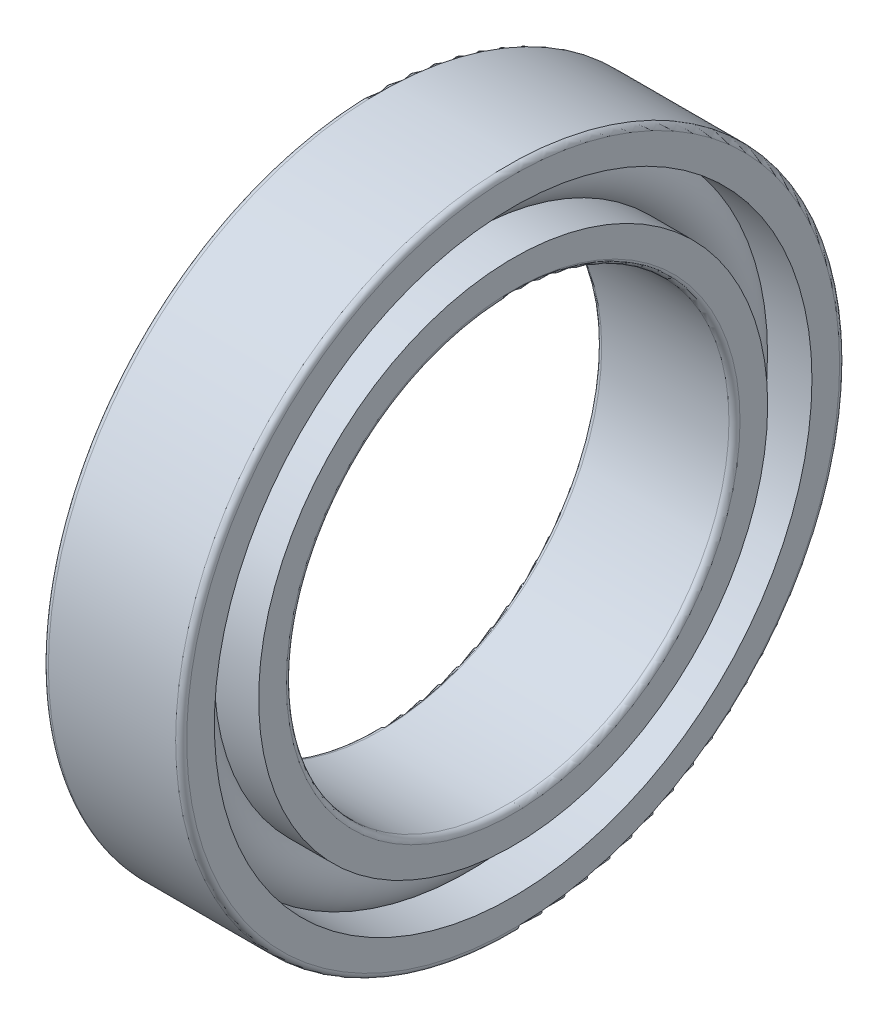
ISO-10303-21;
HEADER;
FILE_DESCRIPTION(('STEP AP214'),'2;1');
FILE_NAME('part.step','',(''),(''),'','','');
FILE_SCHEMA(('AUTOMOTIVE_DESIGN { 1 0 10303 214 1 1 1 1 }'));
ENDSEC;
DATA;
#1=APPLICATION_CONTEXT('core data for automotive mechanical design processes');
#2=APPLICATION_PROTOCOL_DEFINITION('international standard','automotive_design',2000,#1);
#3=PRODUCT_CONTEXT('',#1,'mechanical');
#4=PRODUCT('Part','Part','',(#3));
#5=PRODUCT_RELATED_PRODUCT_CATEGORY('part','',(#4));
#6=PRODUCT_DEFINITION_FORMATION('','',#4);
#7=PRODUCT_DEFINITION_CONTEXT('part definition',#1,'design');
#8=PRODUCT_DEFINITION('design','',#6,#7);
#9=PRODUCT_DEFINITION_SHAPE('','',#8);
#10=(LENGTH_UNIT() NAMED_UNIT(*) SI_UNIT(.MILLI.,.METRE.));
#11=(NAMED_UNIT(*) PLANE_ANGLE_UNIT() SI_UNIT($,.RADIAN.));
#12=(NAMED_UNIT(*) SI_UNIT($,.STERADIAN.) SOLID_ANGLE_UNIT());
#13=UNCERTAINTY_MEASURE_WITH_UNIT(LENGTH_MEASURE(1.E-05),#10,'distance_accuracy_value','');
#14=(GEOMETRIC_REPRESENTATION_CONTEXT(3) GLOBAL_UNCERTAINTY_ASSIGNED_CONTEXT((#13)) GLOBAL_UNIT_ASSIGNED_CONTEXT((#10,
#11,#12)) REPRESENTATION_CONTEXT('',''));
#15=CARTESIAN_POINT('',(0.,0.,0.));
#16=DIRECTION('',(0.,0.,1.));
#17=DIRECTION('',(1.,0.,0.));
#18=AXIS2_PLACEMENT_3D('',#15,#16,#17);
#19=CARTESIAN_POINT('',(0.,0.,0.));
#20=DIRECTION('',(-1.,0.,0.));
#21=DIRECTION('',(0.,0.,1.));
#22=AXIS2_PLACEMENT_3D('',#19,#20,#21);
#23=TOROIDAL_SURFACE('',#22,5.,0.6);
#24=CARTESIAN_POINT('',(0.447213595499953,0.,0.));
#25=DIRECTION('',(-1.,0.,0.));
#26=DIRECTION('',(0.,0.,1.));
#27=AXIS2_PLACEMENT_3D('',#24,#25,#26);
#28=CIRCLE('',#27,5.40000000000001);
#29=CARTESIAN_POINT('',(0.447213595499953,0.,5.40000000000001));
#30=VERTEX_POINT('',#29);
#31=EDGE_CURVE('E35',#30,#30,#28,.F.);
#32=ORIENTED_EDGE('',*,*,#31,.T.);
#33=EDGE_LOOP('',(#32));
#34=FACE_BOUND('',#33,.T.);
#35=CARTESIAN_POINT('',(0.447213595499958,0.,0.));
#36=DIRECTION('',(-1.,0.,0.));
#37=DIRECTION('',(0.,0.,1.));
#38=AXIS2_PLACEMENT_3D('',#35,#36,#37);
#39=CIRCLE('',#38,4.6);
#40=CARTESIAN_POINT('',(0.447213595499958,0.,4.6));
#41=VERTEX_POINT('',#40);
#42=EDGE_CURVE('E10',#41,#41,#39,.T.);
#43=ORIENTED_EDGE('',*,*,#42,.T.);
#44=EDGE_LOOP('',(#43));
#45=FACE_BOUND('',#44,.T.);
#46=ADVANCED_FACE('F31',(#34,#45),#23,.T.);
#47=CARTESIAN_POINT('',(-20.6375,0.,0.));
#48=DIRECTION('',(1.,0.,0.));
#49=DIRECTION('',(0.,0.,-1.));
#50=AXIS2_PLACEMENT_3D('',#47,#48,#49);
#51=CYLINDRICAL_SURFACE('',#50,4.6);
#52=CARTESIAN_POINT('',(1.25,0.,0.));
#53=DIRECTION('',(1.,0.,0.));
#54=DIRECTION('',(0.,0.,-1.));
#55=AXIS2_PLACEMENT_3D('',#52,#53,#54);
#56=CIRCLE('',#55,4.6);
#57=CARTESIAN_POINT('',(1.25,0.,-4.6));
#58=VERTEX_POINT('',#57);
#59=EDGE_CURVE('E44',#58,#58,#56,.T.);
#60=ORIENTED_EDGE('',*,*,#59,.F.);
#61=EDGE_LOOP('',(#60));
#62=FACE_BOUND('',#61,.T.);
#63=ORIENTED_EDGE('',*,*,#42,.F.);
#64=EDGE_LOOP('',(#63));
#65=FACE_BOUND('',#64,.T.);
#66=ADVANCED_FACE('F83',(#62,#65),#51,.T.);
#67=CARTESIAN_POINT('',(-20.6375,0.,0.));
#68=DIRECTION('',(1.,0.,0.));
#69=DIRECTION('',(0.,0.,-1.));
#70=AXIS2_PLACEMENT_3D('',#67,#68,#69);
#71=CYLINDRICAL_SURFACE('',#70,4.6);
#72=CARTESIAN_POINT('',(-1.25,0.,0.));
#73=DIRECTION('',(1.,0.,0.));
#74=DIRECTION('',(0.,0.,-1.));
#75=AXIS2_PLACEMENT_3D('',#72,#73,#74);
#76=CIRCLE('',#75,4.6);
#77=CARTESIAN_POINT('',(-1.25,0.,-4.6));
#78=VERTEX_POINT('',#77);
#79=EDGE_CURVE('E53',#78,#78,#76,.T.);
#80=ORIENTED_EDGE('',*,*,#79,.T.);
#81=EDGE_LOOP('',(#80));
#82=FACE_BOUND('',#81,.T.);
#83=CARTESIAN_POINT('',(-0.447213595499958,0.,0.));
#84=DIRECTION('',(1.,0.,0.));
#85=DIRECTION('',(0.,0.,-1.));
#86=AXIS2_PLACEMENT_3D('',#83,#84,#85);
#87=CIRCLE('',#86,4.6);
#88=CARTESIAN_POINT('',(-0.447213595499958,0.,-4.6));
#89=VERTEX_POINT('',#88);
#90=EDGE_CURVE('E39',#89,#89,#87,.T.);
#91=ORIENTED_EDGE('',*,*,#90,.F.);
#92=EDGE_LOOP('',(#91));
#93=FACE_BOUND('',#92,.T.);
#94=ADVANCED_FACE('F86',(#82,#93),#71,.T.);
#95=CARTESIAN_POINT('',(1.25,4.1,0.));
#96=DIRECTION('',(1.,0.,0.));
#97=DIRECTION('',(0.,0.,-1.));
#98=AXIS2_PLACEMENT_3D('',#95,#96,#97);
#99=PLANE('',#98);
#100=ORIENTED_EDGE('',*,*,#59,.T.);
#101=EDGE_LOOP('',(#100));
#102=FACE_BOUND('',#101,.T.);
#103=CARTESIAN_POINT('',(1.25,0.,0.));
#104=DIRECTION('',(1.,0.,0.));
#105=DIRECTION('',(0.,0.,-1.));
#106=AXIS2_PLACEMENT_3D('',#103,#104,#105);
#107=CIRCLE('',#106,4.1);
#108=CARTESIAN_POINT('',(1.25,0.,-4.1));
#109=VERTEX_POINT('',#108);
#110=EDGE_CURVE('E75',#109,#109,#107,.T.);
#111=ORIENTED_EDGE('',*,*,#110,.F.);
#112=EDGE_LOOP('',(#111));
#113=FACE_BOUND('',#112,.T.);
#114=ADVANCED_FACE('F80',(#102,#113),#99,.T.);
#115=CARTESIAN_POINT('',(1.15,0.,0.));
#116=DIRECTION('',(1.,0.,0.));
#117=DIRECTION('',(0.,0.,-1.));
#118=AXIS2_PLACEMENT_3D('',#115,#116,#117);
#119=TOROIDAL_SURFACE('',#118,4.1,0.1);
#120=ORIENTED_EDGE('',*,*,#110,.T.);
#121=EDGE_LOOP('',(#120));
#122=FACE_BOUND('',#121,.T.);
#123=CARTESIAN_POINT('',(1.15,0.,0.));
#124=DIRECTION('',(1.,0.,0.));
#125=DIRECTION('',(0.,0.,-1.));
#126=AXIS2_PLACEMENT_3D('',#123,#124,#125);
#127=CIRCLE('',#126,4.);
#128=CARTESIAN_POINT('',(1.15,0.,-4.));
#129=VERTEX_POINT('',#128);
#130=EDGE_CURVE('E72',#129,#129,#127,.T.);
#131=ORIENTED_EDGE('',*,*,#130,.F.);
#132=EDGE_LOOP('',(#131));
#133=FACE_BOUND('',#132,.T.);
#134=ADVANCED_FACE('F97',(#122,#133),#119,.T.);
#135=CARTESIAN_POINT('',(-20.6375,0.,0.));
#136=DIRECTION('',(1.,0.,0.));
#137=DIRECTION('',(0.,0.,-1.));
#138=AXIS2_PLACEMENT_3D('',#135,#136,#137);
#139=CYLINDRICAL_SURFACE('',#138,4.);
#140=ORIENTED_EDGE('',*,*,#130,.T.);
#141=EDGE_LOOP('',(#140));
#142=FACE_BOUND('',#141,.T.);
#143=CARTESIAN_POINT('',(-1.15,0.,0.));
#144=DIRECTION('',(1.,0.,0.));
#145=DIRECTION('',(0.,0.,-1.));
#146=AXIS2_PLACEMENT_3D('',#143,#144,#145);
#147=CIRCLE('',#146,4.);
#148=CARTESIAN_POINT('',(-1.15,0.,-4.));
#149=VERTEX_POINT('',#148);
#150=EDGE_CURVE('E69',#149,#149,#147,.T.);
#151=ORIENTED_EDGE('',*,*,#150,.F.);
#152=EDGE_LOOP('',(#151));
#153=FACE_BOUND('',#152,.T.);
#154=ADVANCED_FACE('F100',(#142,#153),#139,.F.);
#155=CARTESIAN_POINT('',(-1.15,0.,0.));
#156=DIRECTION('',(1.,0.,0.));
#157=DIRECTION('',(0.,0.,-1.));
#158=AXIS2_PLACEMENT_3D('',#155,#156,#157);
#159=TOROIDAL_SURFACE('',#158,4.1,0.1);
#160=ORIENTED_EDGE('',*,*,#150,.T.);
#161=EDGE_LOOP('',(#160));
#162=FACE_BOUND('',#161,.T.);
#163=CARTESIAN_POINT('',(-1.25,0.,0.));
#164=DIRECTION('',(1.,0.,0.));
#165=DIRECTION('',(0.,0.,-1.));
#166=AXIS2_PLACEMENT_3D('',#163,#164,#165);
#167=CIRCLE('',#166,4.1);
#168=CARTESIAN_POINT('',(-1.25,0.,-4.1));
#169=VERTEX_POINT('',#168);
#170=EDGE_CURVE('E66',#169,#169,#167,.T.);
#171=ORIENTED_EDGE('',*,*,#170,.F.);
#172=EDGE_LOOP('',(#171));
#173=FACE_BOUND('',#172,.T.);
#174=ADVANCED_FACE('F104',(#162,#173),#159,.T.);
#175=CARTESIAN_POINT('',(-1.25,4.6,0.));
#176=DIRECTION('',(-1.,0.,0.));
#177=DIRECTION('',(0.,0.,1.));
#178=AXIS2_PLACEMENT_3D('',#175,#176,#177);
#179=PLANE('',#178);
#180=ORIENTED_EDGE('',*,*,#170,.T.);
#181=EDGE_LOOP('',(#180));
#182=FACE_BOUND('',#181,.T.);
#183=ORIENTED_EDGE('',*,*,#79,.F.);
#184=EDGE_LOOP('',(#183));
#185=FACE_BOUND('',#184,.T.);
#186=ADVANCED_FACE('F108',(#182,#185),#179,.T.);
#187=CARTESIAN_POINT('',(-0.447213595499953,0.,0.));
#188=DIRECTION('',(1.,0.,0.));
#189=DIRECTION('',(0.,0.,-1.));
#190=AXIS2_PLACEMENT_3D('',#187,#188,#189);
#191=CIRCLE('',#190,5.40000000000001);
#192=CARTESIAN_POINT('',(-0.447213595499953,0.,-5.40000000000001));
#193=VERTEX_POINT('',#192);
#194=EDGE_CURVE('E47',#193,#193,#191,.F.);
#195=ORIENTED_EDGE('',*,*,#194,.T.);
#196=EDGE_LOOP('',(#195));
#197=FACE_BOUND('',#196,.T.);
#198=ORIENTED_EDGE('',*,*,#90,.T.);
#199=EDGE_LOOP('',(#198));
#200=FACE_BOUND('',#199,.T.);
#201=ADVANCED_FACE('F33',(#197,#200),#23,.T.);
#202=CARTESIAN_POINT('',(-20.6375,0.,0.));
#203=DIRECTION('',(1.,0.,0.));
#204=DIRECTION('',(0.,0.,-1.));
#205=AXIS2_PLACEMENT_3D('',#202,#203,#204);
#206=CYLINDRICAL_SURFACE('',#205,5.40000000000001);
#207=CARTESIAN_POINT('',(1.25,0.,0.));
#208=DIRECTION('',(1.,0.,0.));
#209=DIRECTION('',(0.,0.,-1.));
#210=AXIS2_PLACEMENT_3D('',#207,#208,#209);
#211=CIRCLE('',#210,5.40000000000001);
#212=CARTESIAN_POINT('',(1.25,0.,-5.40000000000001));
#213=VERTEX_POINT('',#212);
#214=EDGE_CURVE('E49',#213,#213,#211,.T.);
#215=ORIENTED_EDGE('',*,*,#214,.T.);
#216=EDGE_LOOP('',(#215));
#217=FACE_BOUND('',#216,.T.);
#218=ORIENTED_EDGE('',*,*,#31,.F.);
#219=EDGE_LOOP('',(#218));
#220=FACE_BOUND('',#219,.T.);
#221=ADVANCED_FACE('F113',(#217,#220),#206,.F.);
#222=CARTESIAN_POINT('',(-20.6375,0.,0.));
#223=DIRECTION('',(1.,0.,0.));
#224=DIRECTION('',(0.,0.,-1.));
#225=AXIS2_PLACEMENT_3D('',#222,#223,#224);
#226=CYLINDRICAL_SURFACE('',#225,5.40000000000001);
#227=CARTESIAN_POINT('',(-1.25,0.,0.));
#228=DIRECTION('',(1.,0.,0.));
#229=DIRECTION('',(0.,0.,-1.));
#230=AXIS2_PLACEMENT_3D('',#227,#228,#229);
#231=CIRCLE('',#230,5.40000000000001);
#232=CARTESIAN_POINT('',(-1.25,0.,-5.40000000000001));
#233=VERTEX_POINT('',#232);
#234=EDGE_CURVE('E144',#233,#233,#231,.T.);
#235=ORIENTED_EDGE('',*,*,#234,.F.);
#236=EDGE_LOOP('',(#235));
#237=FACE_BOUND('',#236,.T.);
#238=ORIENTED_EDGE('',*,*,#194,.F.);
#239=EDGE_LOOP('',(#238));
#240=FACE_BOUND('',#239,.T.);
#241=ADVANCED_FACE('F116',(#237,#240),#226,.F.);
#242=CARTESIAN_POINT('',(1.25,5.9,0.));
#243=DIRECTION('',(1.,0.,0.));
#244=DIRECTION('',(0.,0.,-1.));
#245=AXIS2_PLACEMENT_3D('',#242,#243,#244);
#246=PLANE('',#245);
#247=CARTESIAN_POINT('',(1.25,0.,0.));
#248=DIRECTION('',(1.,0.,0.));
#249=DIRECTION('',(0.,0.,-1.));
#250=AXIS2_PLACEMENT_3D('',#247,#248,#249);
#251=CIRCLE('',#250,5.9);
#252=CARTESIAN_POINT('',(1.25,0.,-5.9));
#253=VERTEX_POINT('',#252);
#254=EDGE_CURVE('E55',#253,#253,#251,.T.);
#255=ORIENTED_EDGE('',*,*,#254,.T.);
#256=EDGE_LOOP('',(#255));
#257=FACE_BOUND('',#256,.T.);
#258=ORIENTED_EDGE('',*,*,#214,.F.);
#259=EDGE_LOOP('',(#258));
#260=FACE_BOUND('',#259,.T.);
#261=ADVANCED_FACE('F117',(#257,#260),#246,.T.);
#262=CARTESIAN_POINT('',(1.15,0.,0.));
#263=DIRECTION('',(1.,0.,0.));
#264=DIRECTION('',(0.,0.,-1.));
#265=AXIS2_PLACEMENT_3D('',#262,#263,#264);
#266=TOROIDAL_SURFACE('',#265,5.9,0.0999999999999985);
#267=CARTESIAN_POINT('',(1.15,0.,0.));
#268=DIRECTION('',(1.,0.,0.));
#269=DIRECTION('',(0.,0.,-1.));
#270=AXIS2_PLACEMENT_3D('',#267,#268,#269);
#271=CIRCLE('',#270,6.);
#272=CARTESIAN_POINT('',(1.15,0.,-6.));
#273=VERTEX_POINT('',#272);
#274=EDGE_CURVE('E60',#273,#273,#271,.T.);
#275=ORIENTED_EDGE('',*,*,#274,.T.);
#276=EDGE_LOOP('',(#275));
#277=FACE_BOUND('',#276,.T.);
#278=ORIENTED_EDGE('',*,*,#254,.F.);
#279=EDGE_LOOP('',(#278));
#280=FACE_BOUND('',#279,.T.);
#281=ADVANCED_FACE('F120',(#277,#280),#266,.T.);
#282=CARTESIAN_POINT('',(-20.6375,0.,0.));
#283=DIRECTION('',(1.,0.,0.));
#284=DIRECTION('',(0.,0.,-1.));
#285=AXIS2_PLACEMENT_3D('',#282,#283,#284);
#286=CYLINDRICAL_SURFACE('',#285,6.);
#287=CARTESIAN_POINT('',(-1.15,0.,0.));
#288=DIRECTION('',(1.,0.,0.));
#289=DIRECTION('',(0.,0.,-1.));
#290=AXIS2_PLACEMENT_3D('',#287,#288,#289);
#291=CIRCLE('',#290,6.);
#292=CARTESIAN_POINT('',(-1.15,0.,-6.));
#293=VERTEX_POINT('',#292);
#294=EDGE_CURVE('E148',#293,#293,#291,.T.);
#295=ORIENTED_EDGE('',*,*,#294,.T.);
#296=EDGE_LOOP('',(#295));
#297=FACE_BOUND('',#296,.T.);
#298=ORIENTED_EDGE('',*,*,#274,.F.);
#299=EDGE_LOOP('',(#298));
#300=FACE_BOUND('',#299,.T.);
#301=ADVANCED_FACE('F124',(#297,#300),#286,.T.);
#302=CARTESIAN_POINT('',(-1.15,0.,0.));
#303=DIRECTION('',(1.,0.,0.));
#304=DIRECTION('',(0.,0.,-1.));
#305=AXIS2_PLACEMENT_3D('',#302,#303,#304);
#306=TOROIDAL_SURFACE('',#305,5.9,0.0999999999999985);
#307=CARTESIAN_POINT('',(-1.25,0.,0.));
#308=DIRECTION('',(1.,0.,0.));
#309=DIRECTION('',(0.,0.,-1.));
#310=AXIS2_PLACEMENT_3D('',#307,#308,#309);
#311=CIRCLE('',#310,5.9);
#312=CARTESIAN_POINT('',(-1.25,0.,-5.9));
#313=VERTEX_POINT('',#312);
#314=EDGE_CURVE('E145',#313,#313,#311,.T.);
#315=ORIENTED_EDGE('',*,*,#314,.T.);
#316=EDGE_LOOP('',(#315));
#317=FACE_BOUND('',#316,.T.);
#318=ORIENTED_EDGE('',*,*,#294,.F.);
#319=EDGE_LOOP('',(#318));
#320=FACE_BOUND('',#319,.T.);
#321=ADVANCED_FACE('F128',(#317,#320),#306,.T.);
#322=CARTESIAN_POINT('',(-1.25,5.40000000000001,0.));
#323=DIRECTION('',(-1.,0.,0.));
#324=DIRECTION('',(0.,0.,1.));
#325=AXIS2_PLACEMENT_3D('',#322,#323,#324);
#326=PLANE('',#325);
#327=ORIENTED_EDGE('',*,*,#234,.T.);
#328=EDGE_LOOP('',(#327));
#329=FACE_BOUND('',#328,.T.);
#330=ORIENTED_EDGE('',*,*,#314,.F.);
#331=EDGE_LOOP('',(#330));
#332=FACE_BOUND('',#331,.T.);
#333=ADVANCED_FACE('F132',(#329,#332),#326,.T.);
#334=CLOSED_SHELL('',(#46,#66,#94,#114,#134,#154,#174,#186,#201,#221,#241,#261,#281,#301,#321,#333));
#335=MANIFOLD_SOLID_BREP('B2',#334);
#336=ADVANCED_BREP_SHAPE_REPRESENTATION('',(#18,#335),#14);
#337=SHAPE_DEFINITION_REPRESENTATION(#9,#336);
ENDSEC;
END-ISO-10303-21;
